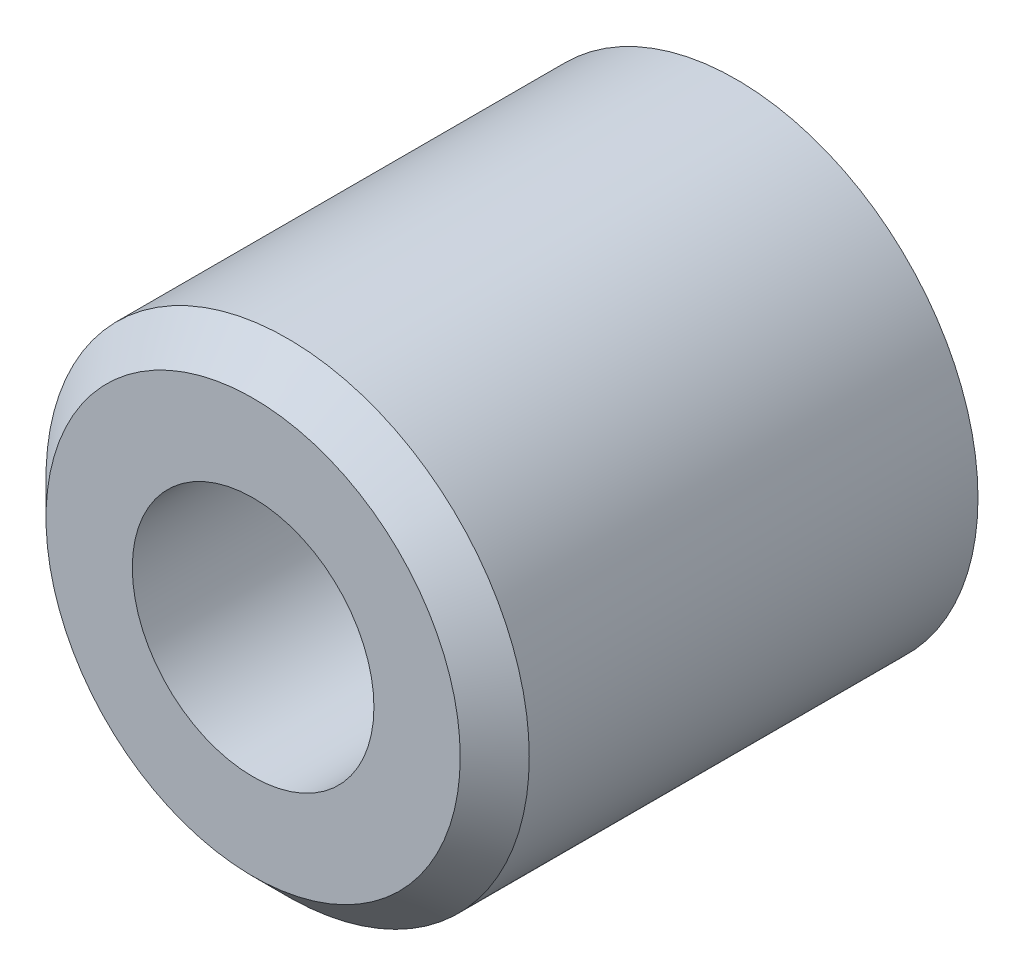
ISO-10303-21;
HEADER;
FILE_DESCRIPTION(('STEP AP214'),'2;1');
FILE_NAME('part.step','',(''),(''),'','','');
FILE_SCHEMA(('AUTOMOTIVE_DESIGN { 1 0 10303 214 1 1 1 1 }'));
ENDSEC;
DATA;
#1=APPLICATION_CONTEXT('core data for automotive mechanical design processes');
#2=APPLICATION_PROTOCOL_DEFINITION('international standard','automotive_design',2000,#1);
#3=PRODUCT_CONTEXT('',#1,'mechanical');
#4=PRODUCT('Part','Part','',(#3));
#5=PRODUCT_RELATED_PRODUCT_CATEGORY('part','',(#4));
#6=PRODUCT_DEFINITION_FORMATION('','',#4);
#7=PRODUCT_DEFINITION_CONTEXT('part definition',#1,'design');
#8=PRODUCT_DEFINITION('design','',#6,#7);
#9=PRODUCT_DEFINITION_SHAPE('','',#8);
#10=(LENGTH_UNIT() NAMED_UNIT(*) SI_UNIT(.MILLI.,.METRE.));
#11=(NAMED_UNIT(*) PLANE_ANGLE_UNIT() SI_UNIT($,.RADIAN.));
#12=(NAMED_UNIT(*) SI_UNIT($,.STERADIAN.) SOLID_ANGLE_UNIT());
#13=UNCERTAINTY_MEASURE_WITH_UNIT(LENGTH_MEASURE(1.E-05),#10,'distance_accuracy_value','');
#14=(GEOMETRIC_REPRESENTATION_CONTEXT(3) GLOBAL_UNCERTAINTY_ASSIGNED_CONTEXT((#13)) GLOBAL_UNIT_ASSIGNED_CONTEXT((#10,
#11,#12)) REPRESENTATION_CONTEXT('',''));
#15=CARTESIAN_POINT('',(0.,0.,0.));
#16=DIRECTION('',(0.,0.,1.));
#17=DIRECTION('',(1.,0.,0.));
#18=AXIS2_PLACEMENT_3D('',#15,#16,#17);
#19=CARTESIAN_POINT('',(0.,0.,7.));
#20=DIRECTION('',(0.,0.,1.));
#21=DIRECTION('',(1.,0.,0.));
#22=AXIS2_PLACEMENT_3D('',#19,#20,#21);
#23=PLANE('',#22);
#24=CARTESIAN_POINT('',(0.,0.,7.));
#25=DIRECTION('',(0.,0.,1.));
#26=DIRECTION('',(1.,0.,0.));
#27=AXIS2_PLACEMENT_3D('',#24,#25,#26);
#28=CIRCLE('',#27,3.);
#29=CARTESIAN_POINT('',(3.,0.,7.));
#30=VERTEX_POINT('',#29);
#31=EDGE_CURVE('E40',#30,#30,#28,.T.);
#32=ORIENTED_EDGE('',*,*,#31,.T.);
#33=EDGE_LOOP('',(#32));
#34=FACE_BOUND('',#33,.T.);
#35=CARTESIAN_POINT('',(0.,0.,7.));
#36=DIRECTION('',(0.,0.,1.));
#37=DIRECTION('',(1.,0.,0.));
#38=AXIS2_PLACEMENT_3D('',#35,#36,#37);
#39=CIRCLE('',#38,1.75);
#40=CARTESIAN_POINT('',(1.75,0.,7.));
#41=VERTEX_POINT('',#40);
#42=EDGE_CURVE('E48',#41,#41,#39,.T.);
#43=ORIENTED_EDGE('',*,*,#42,.F.);
#44=EDGE_LOOP('',(#43));
#45=FACE_BOUND('',#44,.T.);
#46=ADVANCED_FACE('F33',(#34,#45),#23,.T.);
#47=CARTESIAN_POINT('',(0.,0.,0.));
#48=DIRECTION('',(0.,0.,1.));
#49=DIRECTION('',(1.,0.,0.));
#50=AXIS2_PLACEMENT_3D('',#47,#48,#49);
#51=PLANE('',#50);
#52=CARTESIAN_POINT('',(0.,0.,0.));
#53=DIRECTION('',(0.,0.,1.));
#54=DIRECTION('',(1.,0.,0.));
#55=AXIS2_PLACEMENT_3D('',#52,#53,#54);
#56=CIRCLE('',#55,3.5);
#57=CARTESIAN_POINT('',(3.5,0.,0.));
#58=VERTEX_POINT('',#57);
#59=EDGE_CURVE('E44',#58,#58,#56,.T.);
#60=ORIENTED_EDGE('',*,*,#59,.F.);
#61=EDGE_LOOP('',(#60));
#62=FACE_BOUND('',#61,.T.);
#63=CARTESIAN_POINT('',(0.,0.,0.));
#64=DIRECTION('',(0.,0.,1.));
#65=DIRECTION('',(1.,0.,0.));
#66=AXIS2_PLACEMENT_3D('',#63,#64,#65);
#67=CIRCLE('',#66,1.75);
#68=CARTESIAN_POINT('',(1.75,0.,0.));
#69=VERTEX_POINT('',#68);
#70=EDGE_CURVE('E51',#69,#69,#67,.T.);
#71=ORIENTED_EDGE('',*,*,#70,.T.);
#72=EDGE_LOOP('',(#71));
#73=FACE_BOUND('',#72,.T.);
#74=ADVANCED_FACE('F61',(#62,#73),#51,.F.);
#75=CARTESIAN_POINT('',(0.,0.,7.));
#76=DIRECTION('',(0.,0.,-1.));
#77=DIRECTION('',(-1.,0.,0.));
#78=AXIS2_PLACEMENT_3D('',#75,#76,#77);
#79=CYLINDRICAL_SURFACE('',#78,3.5);
#80=CARTESIAN_POINT('',(0.,0.,6.5));
#81=DIRECTION('',(0.,0.,1.));
#82=DIRECTION('',(1.,0.,0.));
#83=AXIS2_PLACEMENT_3D('',#80,#81,#82);
#84=CIRCLE('',#83,3.5);
#85=CARTESIAN_POINT('',(3.5,0.,6.5));
#86=VERTEX_POINT('',#85);
#87=EDGE_CURVE('E10',#86,#86,#84,.F.);
#88=ORIENTED_EDGE('',*,*,#87,.T.);
#89=EDGE_LOOP('',(#88));
#90=FACE_BOUND('',#89,.T.);
#91=ORIENTED_EDGE('',*,*,#59,.T.);
#92=EDGE_LOOP('',(#91));
#93=FACE_BOUND('',#92,.T.);
#94=ADVANCED_FACE('F68',(#90,#93),#79,.T.);
#95=CARTESIAN_POINT('',(0.,0.,7.));
#96=DIRECTION('',(0.,0.,-1.));
#97=DIRECTION('',(-1.,0.,0.));
#98=AXIS2_PLACEMENT_3D('',#95,#96,#97);
#99=CYLINDRICAL_SURFACE('',#98,1.75);
#100=ORIENTED_EDGE('',*,*,#42,.T.);
#101=EDGE_LOOP('',(#100));
#102=FACE_BOUND('',#101,.T.);
#103=ORIENTED_EDGE('',*,*,#70,.F.);
#104=EDGE_LOOP('',(#103));
#105=FACE_BOUND('',#104,.T.);
#106=ADVANCED_FACE('F57',(#102,#105),#99,.F.);
#107=CARTESIAN_POINT('',(0.,0.,7.));
#108=DIRECTION('',(0.,0.,-1.));
#109=DIRECTION('',(-1.,0.,0.));
#110=AXIS2_PLACEMENT_3D('',#107,#108,#109);
#111=CONICAL_SURFACE('',#110,3.,0.785398163397447);
#112=ORIENTED_EDGE('',*,*,#87,.F.);
#113=EDGE_LOOP('',(#112));
#114=FACE_BOUND('',#113,.T.);
#115=ORIENTED_EDGE('',*,*,#31,.F.);
#116=EDGE_LOOP('',(#115));
#117=FACE_BOUND('',#116,.T.);
#118=ADVANCED_FACE('F35',(#114,#117),#111,.T.);
#119=CLOSED_SHELL('',(#46,#74,#94,#106,#118));
#120=MANIFOLD_SOLID_BREP('B2',#119);
#121=ADVANCED_BREP_SHAPE_REPRESENTATION('',(#18,#120),#14);
#122=SHAPE_DEFINITION_REPRESENTATION(#9,#121);
ENDSEC;
END-ISO-10303-21;
